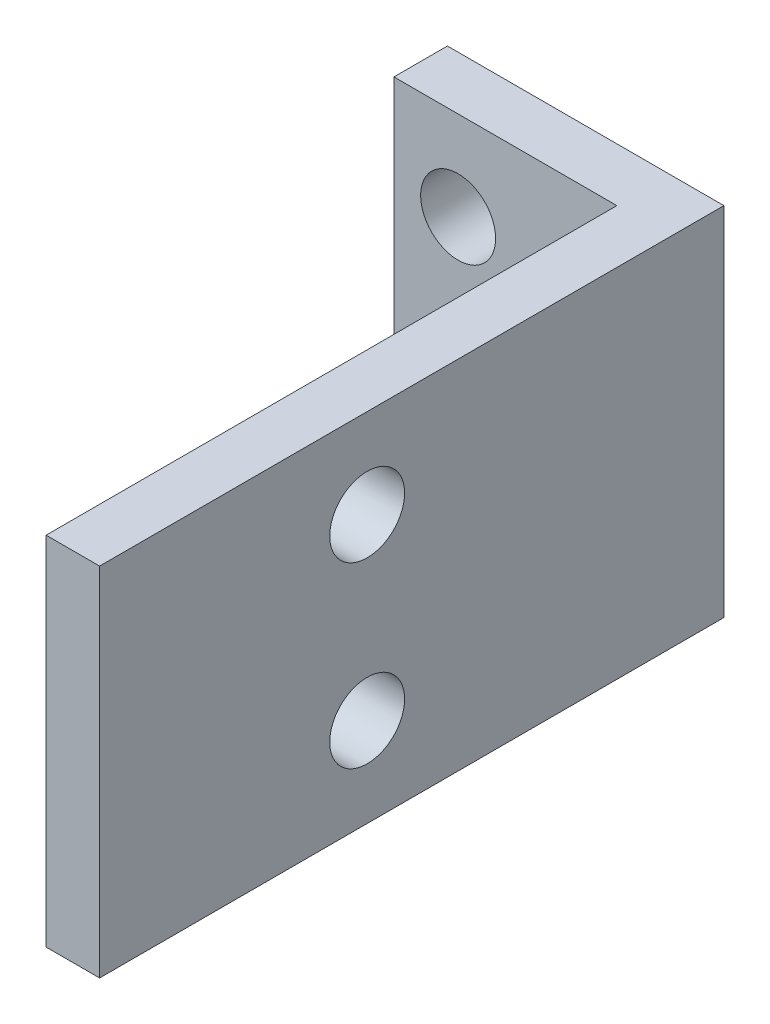
ISO-10303-21;
HEADER;
FILE_DESCRIPTION(('STEP AP214'),'2;1');
FILE_NAME('part.step','',(''),(''),'','','');
FILE_SCHEMA(('AUTOMOTIVE_DESIGN { 1 0 10303 214 1 1 1 1 }'));
ENDSEC;
DATA;
#1=APPLICATION_CONTEXT('core data for automotive mechanical design processes');
#2=APPLICATION_PROTOCOL_DEFINITION('international standard','automotive_design',2000,#1);
#3=PRODUCT_CONTEXT('',#1,'mechanical');
#4=PRODUCT('Part','Part','',(#3));
#5=PRODUCT_RELATED_PRODUCT_CATEGORY('part','',(#4));
#6=PRODUCT_DEFINITION_FORMATION('','',#4);
#7=PRODUCT_DEFINITION_CONTEXT('part definition',#1,'design');
#8=PRODUCT_DEFINITION('design','',#6,#7);
#9=PRODUCT_DEFINITION_SHAPE('','',#8);
#10=(LENGTH_UNIT() NAMED_UNIT(*) SI_UNIT(.MILLI.,.METRE.));
#11=(NAMED_UNIT(*) PLANE_ANGLE_UNIT() SI_UNIT($,.RADIAN.));
#12=(NAMED_UNIT(*) SI_UNIT($,.STERADIAN.) SOLID_ANGLE_UNIT());
#13=UNCERTAINTY_MEASURE_WITH_UNIT(LENGTH_MEASURE(1.E-05),#10,'distance_accuracy_value','');
#14=(GEOMETRIC_REPRESENTATION_CONTEXT(3) GLOBAL_UNCERTAINTY_ASSIGNED_CONTEXT((#13)) GLOBAL_UNIT_ASSIGNED_CONTEXT((#10,
#11,#12)) REPRESENTATION_CONTEXT('',''));
#15=CARTESIAN_POINT('',(0.,0.,0.));
#16=DIRECTION('',(0.,0.,1.));
#17=DIRECTION('',(1.,0.,0.));
#18=AXIS2_PLACEMENT_3D('',#15,#16,#17);
#19=CARTESIAN_POINT('',(36.,-30.,-9.99999999999995));
#20=DIRECTION('',(0.,0.,-1.));
#21=DIRECTION('',(-1.,0.,0.));
#22=AXIS2_PLACEMENT_3D('',#19,#20,#21);
#23=PLANE('',#22);
#24=CARTESIAN_POINT('',(24.1,-45.,-9.99999999999995));
#25=DIRECTION('',(0.,0.,1.));
#26=DIRECTION('',(1.,0.,0.));
#27=AXIS2_PLACEMENT_3D('',#24,#25,#26);
#28=CIRCLE('',#27,2.09999999999999);
#29=CARTESIAN_POINT('',(26.2,-45.,-9.99999999999995));
#30=VERTEX_POINT('',#29);
#31=EDGE_CURVE('E163',#30,#30,#28,.T.);
#32=ORIENTED_EDGE('',*,*,#31,.T.);
#33=EDGE_LOOP('',(#32));
#34=FACE_BOUND('',#33,.T.);
#35=CARTESIAN_POINT('',(24.1,-35.,-9.99999999999995));
#36=DIRECTION('',(0.,0.,1.));
#37=DIRECTION('',(1.,0.,0.));
#38=AXIS2_PLACEMENT_3D('',#35,#36,#37);
#39=CIRCLE('',#38,2.09999999999999);
#40=CARTESIAN_POINT('',(26.2,-35.,-9.99999999999995));
#41=VERTEX_POINT('',#40);
#42=EDGE_CURVE('E166',#41,#41,#39,.T.);
#43=ORIENTED_EDGE('',*,*,#42,.T.);
#44=EDGE_LOOP('',(#43));
#45=FACE_BOUND('',#44,.T.);
#46=DIRECTION('',(0.,-1.,0.));
#47=VECTOR('',#46,1.);
#48=CARTESIAN_POINT('',(20.5000000000001,-30.,-9.99999999999995));
#49=LINE('',#48,#47);
#50=CARTESIAN_POINT('',(20.5000000000001,-30.,-9.99999999999995));
#51=VERTEX_POINT('',#50);
#52=CARTESIAN_POINT('',(20.5000000000001,-50.,-9.99999999999995));
#53=VERTEX_POINT('',#52);
#54=EDGE_CURVE('E119',#51,#53,#49,.T.);
#55=ORIENTED_EDGE('',*,*,#54,.F.);
#56=DIRECTION('',(-1.,0.,0.));
#57=VECTOR('',#56,1.);
#58=CARTESIAN_POINT('',(36.,-30.,-9.99999999999995));
#59=LINE('',#58,#57);
#60=CARTESIAN_POINT('',(36.,-30.,-9.99999999999995));
#61=VERTEX_POINT('',#60);
#62=EDGE_CURVE('E11',#61,#51,#59,.T.);
#63=ORIENTED_EDGE('',*,*,#62,.F.);
#64=DIRECTION('',(0.,-1.,0.));
#65=VECTOR('',#64,1.);
#66=CARTESIAN_POINT('',(36.,-30.,-9.99999999999995));
#67=LINE('',#66,#65);
#68=CARTESIAN_POINT('',(36.,-50.,-9.99999999999995));
#69=VERTEX_POINT('',#68);
#70=EDGE_CURVE('E122',#61,#69,#67,.T.);
#71=ORIENTED_EDGE('',*,*,#70,.T.);
#72=DIRECTION('',(-1.,0.,0.));
#73=VECTOR('',#72,1.);
#74=CARTESIAN_POINT('',(36.,-50.,-9.99999999999995));
#75=LINE('',#74,#73);
#76=EDGE_CURVE('E77',#69,#53,#75,.T.);
#77=ORIENTED_EDGE('',*,*,#76,.T.);
#78=EDGE_LOOP('',(#55,#63,#71,#77));
#79=FACE_BOUND('',#78,.T.);
#80=ADVANCED_FACE('F32',(#34,#45,#79),#23,.T.);
#81=CARTESIAN_POINT('',(36.,-30.,25.0000000000001));
#82=DIRECTION('',(0.,1.,0.));
#83=DIRECTION('',(-1.,0.,0.));
#84=AXIS2_PLACEMENT_3D('',#81,#82,#83);
#85=PLANE('',#84);
#86=DIRECTION('',(0.,0.,1.));
#87=VECTOR('',#86,1.);
#88=CARTESIAN_POINT('',(33.,-30.,-6.99999999999995));
#89=LINE('',#88,#87);
#90=CARTESIAN_POINT('',(33.,-30.,-6.99999999999995));
#91=VERTEX_POINT('',#90);
#92=CARTESIAN_POINT('',(33.,-30.,25.0000000000001));
#93=VERTEX_POINT('',#92);
#94=EDGE_CURVE('E104',#91,#93,#89,.T.);
#95=ORIENTED_EDGE('',*,*,#94,.T.);
#96=DIRECTION('',(-1.,0.,0.));
#97=VECTOR('',#96,1.);
#98=CARTESIAN_POINT('',(36.,-30.,25.0000000000001));
#99=LINE('',#98,#97);
#100=CARTESIAN_POINT('',(36.,-30.,25.0000000000001));
#101=VERTEX_POINT('',#100);
#102=EDGE_CURVE('E40',#101,#93,#99,.T.);
#103=ORIENTED_EDGE('',*,*,#102,.F.);
#104=DIRECTION('',(0.,0.,-1.));
#105=VECTOR('',#104,1.);
#106=CARTESIAN_POINT('',(36.,-30.,25.0000000000001));
#107=LINE('',#106,#105);
#108=EDGE_CURVE('E129',#101,#61,#107,.T.);
#109=ORIENTED_EDGE('',*,*,#108,.T.);
#110=ORIENTED_EDGE('',*,*,#62,.T.);
#111=DIRECTION('',(0.,0.,-1.));
#112=VECTOR('',#111,1.);
#113=CARTESIAN_POINT('',(20.5000000000001,-30.,25.0000000000001));
#114=LINE('',#113,#112);
#115=CARTESIAN_POINT('',(20.5000000000001,-30.,-6.99999999999996));
#116=VERTEX_POINT('',#115);
#117=EDGE_CURVE('E71',#116,#51,#114,.T.);
#118=ORIENTED_EDGE('',*,*,#117,.F.);
#119=DIRECTION('',(1.,0.,0.));
#120=VECTOR('',#119,1.);
#121=CARTESIAN_POINT('',(20.5000000000001,-30.,-6.99999999999995));
#122=LINE('',#121,#120);
#123=EDGE_CURVE('E48',#116,#91,#122,.T.);
#124=ORIENTED_EDGE('',*,*,#123,.T.);
#125=EDGE_LOOP('',(#95,#103,#109,#110,#118,#124));
#126=FACE_BOUND('',#125,.T.);
#127=ADVANCED_FACE('F110',(#126),#85,.T.);
#128=CARTESIAN_POINT('',(36.,-50.,25.0000000000001));
#129=DIRECTION('',(0.,0.,1.));
#130=DIRECTION('',(1.,0.,0.));
#131=AXIS2_PLACEMENT_3D('',#128,#129,#130);
#132=PLANE('',#131);
#133=DIRECTION('',(0.,-1.,0.));
#134=VECTOR('',#133,1.);
#135=CARTESIAN_POINT('',(33.,-30.,25.0000000000001));
#136=LINE('',#135,#134);
#137=CARTESIAN_POINT('',(33.,-50.,25.0000000000001));
#138=VERTEX_POINT('',#137);
#139=EDGE_CURVE('E100',#93,#138,#136,.T.);
#140=ORIENTED_EDGE('',*,*,#139,.T.);
#141=DIRECTION('',(-1.,0.,0.));
#142=VECTOR('',#141,1.);
#143=CARTESIAN_POINT('',(36.,-50.,25.0000000000001));
#144=LINE('',#143,#142);
#145=CARTESIAN_POINT('',(36.,-50.,25.0000000000001));
#146=VERTEX_POINT('',#145);
#147=EDGE_CURVE('E138',#146,#138,#144,.T.);
#148=ORIENTED_EDGE('',*,*,#147,.F.);
#149=DIRECTION('',(0.,1.,0.));
#150=VECTOR('',#149,1.);
#151=CARTESIAN_POINT('',(36.,-50.,25.0000000000001));
#152=LINE('',#151,#150);
#153=EDGE_CURVE('E126',#146,#101,#152,.T.);
#154=ORIENTED_EDGE('',*,*,#153,.T.);
#155=ORIENTED_EDGE('',*,*,#102,.T.);
#156=EDGE_LOOP('',(#140,#148,#154,#155));
#157=FACE_BOUND('',#156,.T.);
#158=ADVANCED_FACE('F159',(#157),#132,.T.);
#159=CARTESIAN_POINT('',(36.,-50.,-9.99999999999995));
#160=DIRECTION('',(0.,-1.,0.));
#161=DIRECTION('',(1.,0.,0.));
#162=AXIS2_PLACEMENT_3D('',#159,#160,#161);
#163=PLANE('',#162);
#164=DIRECTION('',(0.,0.,1.));
#165=VECTOR('',#164,1.);
#166=CARTESIAN_POINT('',(33.,-50.,-6.99999999999995));
#167=LINE('',#166,#165);
#168=CARTESIAN_POINT('',(33.,-50.,-6.99999999999995));
#169=VERTEX_POINT('',#168);
#170=EDGE_CURVE('E111',#169,#138,#167,.T.);
#171=ORIENTED_EDGE('',*,*,#170,.F.);
#172=DIRECTION('',(1.,0.,0.));
#173=VECTOR('',#172,1.);
#174=CARTESIAN_POINT('',(20.5,-50.,-6.99999999999995));
#175=LINE('',#174,#173);
#176=CARTESIAN_POINT('',(20.5,-50.,-6.99999999999995));
#177=VERTEX_POINT('',#176);
#178=EDGE_CURVE('E97',#177,#169,#175,.T.);
#179=ORIENTED_EDGE('',*,*,#178,.F.);
#180=DIRECTION('',(0.,0.,1.));
#181=VECTOR('',#180,1.);
#182=CARTESIAN_POINT('',(20.5000000000001,-50.,-9.99999999999995));
#183=LINE('',#182,#181);
#184=EDGE_CURVE('E133',#53,#177,#183,.T.);
#185=ORIENTED_EDGE('',*,*,#184,.F.);
#186=ORIENTED_EDGE('',*,*,#76,.F.);
#187=DIRECTION('',(0.,0.,1.));
#188=VECTOR('',#187,1.);
#189=CARTESIAN_POINT('',(36.,-50.,-9.99999999999995));
#190=LINE('',#189,#188);
#191=EDGE_CURVE('E124',#69,#146,#190,.T.);
#192=ORIENTED_EDGE('',*,*,#191,.T.);
#193=ORIENTED_EDGE('',*,*,#147,.T.);
#194=EDGE_LOOP('',(#171,#179,#185,#186,#192,#193));
#195=FACE_BOUND('',#194,.T.);
#196=ADVANCED_FACE('F140',(#195),#163,.T.);
#197=CARTESIAN_POINT('',(36.0000000000001,0.,0.));
#198=DIRECTION('',(-1.,0.,0.));
#199=DIRECTION('',(0.,-1.,0.));
#200=AXIS2_PLACEMENT_3D('',#197,#198,#199);
#201=PLANE('',#200);
#202=CARTESIAN_POINT('',(36.,-35.,10.0000000000001));
#203=DIRECTION('',(1.,0.,0.));
#204=DIRECTION('',(0.,0.,-1.));
#205=AXIS2_PLACEMENT_3D('',#202,#203,#204);
#206=CIRCLE('',#205,2.09999999999998);
#207=CARTESIAN_POINT('',(36.,-35.,7.90000000000012));
#208=VERTEX_POINT('',#207);
#209=EDGE_CURVE('E168',#208,#208,#206,.T.);
#210=ORIENTED_EDGE('',*,*,#209,.F.);
#211=EDGE_LOOP('',(#210));
#212=FACE_BOUND('',#211,.T.);
#213=CARTESIAN_POINT('',(36.,-45.,10.));
#214=DIRECTION('',(1.,0.,0.));
#215=DIRECTION('',(0.,0.,-1.));
#216=AXIS2_PLACEMENT_3D('',#213,#214,#215);
#217=CIRCLE('',#216,2.09999999999998);
#218=CARTESIAN_POINT('',(36.,-45.,7.90000000000002));
#219=VERTEX_POINT('',#218);
#220=EDGE_CURVE('E176',#219,#219,#217,.T.);
#221=ORIENTED_EDGE('',*,*,#220,.F.);
#222=EDGE_LOOP('',(#221));
#223=FACE_BOUND('',#222,.T.);
#224=ORIENTED_EDGE('',*,*,#70,.F.);
#225=ORIENTED_EDGE('',*,*,#108,.F.);
#226=ORIENTED_EDGE('',*,*,#153,.F.);
#227=ORIENTED_EDGE('',*,*,#191,.F.);
#228=EDGE_LOOP('',(#224,#225,#226,#227));
#229=FACE_BOUND('',#228,.T.);
#230=ADVANCED_FACE('F143',(#212,#223,#229),#201,.F.);
#231=CARTESIAN_POINT('',(20.5000000000001,0.,0.));
#232=DIRECTION('',(-1.,0.,0.));
#233=DIRECTION('',(0.,-1.,0.));
#234=AXIS2_PLACEMENT_3D('',#231,#232,#233);
#235=PLANE('',#234);
#236=DIRECTION('',(0.,-1.,0.));
#237=VECTOR('',#236,1.);
#238=CARTESIAN_POINT('',(20.5000000000001,-30.,-6.99999999999995));
#239=LINE('',#238,#237);
#240=EDGE_CURVE('E101',#116,#177,#239,.T.);
#241=ORIENTED_EDGE('',*,*,#240,.F.);
#242=ORIENTED_EDGE('',*,*,#117,.T.);
#243=ORIENTED_EDGE('',*,*,#54,.T.);
#244=ORIENTED_EDGE('',*,*,#184,.T.);
#245=EDGE_LOOP('',(#241,#242,#243,#244));
#246=FACE_BOUND('',#245,.T.);
#247=ADVANCED_FACE('F141',(#246),#235,.T.);
#248=CARTESIAN_POINT('',(33.,-30.,-6.99999999999995));
#249=DIRECTION('',(1.,0.,0.));
#250=DIRECTION('',(0.,1.,0.));
#251=AXIS2_PLACEMENT_3D('',#248,#249,#250);
#252=PLANE('',#251);
#253=CARTESIAN_POINT('',(33.,-35.,10.0000000000001));
#254=DIRECTION('',(1.,0.,0.));
#255=DIRECTION('',(0.,1.,0.));
#256=AXIS2_PLACEMENT_3D('',#253,#254,#255);
#257=CIRCLE('',#256,2.09999999999998);
#258=CARTESIAN_POINT('',(33.,-32.9,10.0000000000001));
#259=VERTEX_POINT('',#258);
#260=EDGE_CURVE('E35',#259,#259,#257,.T.);
#261=ORIENTED_EDGE('',*,*,#260,.T.);
#262=EDGE_LOOP('',(#261));
#263=FACE_BOUND('',#262,.T.);
#264=CARTESIAN_POINT('',(33.,-45.,10.));
#265=DIRECTION('',(1.,0.,0.));
#266=DIRECTION('',(0.,1.,0.));
#267=AXIS2_PLACEMENT_3D('',#264,#265,#266);
#268=CIRCLE('',#267,2.09999999999998);
#269=CARTESIAN_POINT('',(33.,-42.9,10.));
#270=VERTEX_POINT('',#269);
#271=EDGE_CURVE('E115',#270,#270,#268,.T.);
#272=ORIENTED_EDGE('',*,*,#271,.T.);
#273=EDGE_LOOP('',(#272));
#274=FACE_BOUND('',#273,.T.);
#275=ORIENTED_EDGE('',*,*,#170,.T.);
#276=ORIENTED_EDGE('',*,*,#139,.F.);
#277=ORIENTED_EDGE('',*,*,#94,.F.);
#278=DIRECTION('',(0.,-1.,0.));
#279=VECTOR('',#278,1.);
#280=CARTESIAN_POINT('',(33.,-30.,-6.99999999999995));
#281=LINE('',#280,#279);
#282=EDGE_CURVE('E93',#91,#169,#281,.T.);
#283=ORIENTED_EDGE('',*,*,#282,.T.);
#284=EDGE_LOOP('',(#275,#276,#277,#283));
#285=FACE_BOUND('',#284,.T.);
#286=ADVANCED_FACE('F105',(#263,#274,#285),#252,.F.);
#287=CARTESIAN_POINT('',(20.5000000000001,-30.,-6.99999999999995));
#288=DIRECTION('',(0.,0.,-1.));
#289=DIRECTION('',(0.,1.,0.));
#290=AXIS2_PLACEMENT_3D('',#287,#288,#289);
#291=PLANE('',#290);
#292=CARTESIAN_POINT('',(24.1,-45.,-6.99999999999996));
#293=DIRECTION('',(0.,0.,1.));
#294=DIRECTION('',(1.,0.,0.));
#295=AXIS2_PLACEMENT_3D('',#292,#293,#294);
#296=CIRCLE('',#295,2.09999999999999);
#297=CARTESIAN_POINT('',(26.2,-45.,-6.99999999999996));
#298=VERTEX_POINT('',#297);
#299=EDGE_CURVE('E207',#298,#298,#296,.T.);
#300=ORIENTED_EDGE('',*,*,#299,.F.);
#301=EDGE_LOOP('',(#300));
#302=FACE_BOUND('',#301,.T.);
#303=CARTESIAN_POINT('',(24.1,-35.,-6.99999999999996));
#304=DIRECTION('',(0.,0.,1.));
#305=DIRECTION('',(1.,0.,0.));
#306=AXIS2_PLACEMENT_3D('',#303,#304,#305);
#307=CIRCLE('',#306,2.09999999999999);
#308=CARTESIAN_POINT('',(26.2,-35.,-6.99999999999996));
#309=VERTEX_POINT('',#308);
#310=EDGE_CURVE('E169',#309,#309,#307,.T.);
#311=ORIENTED_EDGE('',*,*,#310,.F.);
#312=EDGE_LOOP('',(#311));
#313=FACE_BOUND('',#312,.T.);
#314=ORIENTED_EDGE('',*,*,#178,.T.);
#315=ORIENTED_EDGE('',*,*,#282,.F.);
#316=ORIENTED_EDGE('',*,*,#123,.F.);
#317=ORIENTED_EDGE('',*,*,#240,.T.);
#318=EDGE_LOOP('',(#314,#315,#316,#317));
#319=FACE_BOUND('',#318,.T.);
#320=ADVANCED_FACE('F95',(#302,#313,#319),#291,.F.);
#321=CARTESIAN_POINT('',(36.,-45.,10.));
#322=DIRECTION('',(1.,0.,0.));
#323=DIRECTION('',(0.,0.,-1.));
#324=AXIS2_PLACEMENT_3D('',#321,#322,#323);
#325=CYLINDRICAL_SURFACE('',#324,2.09999999999998);
#326=ORIENTED_EDGE('',*,*,#220,.T.);
#327=EDGE_LOOP('',(#326));
#328=FACE_BOUND('',#327,.T.);
#329=ORIENTED_EDGE('',*,*,#271,.F.);
#330=EDGE_LOOP('',(#329));
#331=FACE_BOUND('',#330,.T.);
#332=ADVANCED_FACE('F188',(#328,#331),#325,.F.);
#333=CARTESIAN_POINT('',(36.,-35.,10.0000000000001));
#334=DIRECTION('',(1.,0.,0.));
#335=DIRECTION('',(0.,0.,-1.));
#336=AXIS2_PLACEMENT_3D('',#333,#334,#335);
#337=CYLINDRICAL_SURFACE('',#336,2.09999999999998);
#338=ORIENTED_EDGE('',*,*,#209,.T.);
#339=EDGE_LOOP('',(#338));
#340=FACE_BOUND('',#339,.T.);
#341=ORIENTED_EDGE('',*,*,#260,.F.);
#342=EDGE_LOOP('',(#341));
#343=FACE_BOUND('',#342,.T.);
#344=ADVANCED_FACE('F185',(#340,#343),#337,.F.);
#345=CARTESIAN_POINT('',(24.1,-35.,-6.99999999999996));
#346=DIRECTION('',(0.,0.,1.));
#347=DIRECTION('',(1.,0.,0.));
#348=AXIS2_PLACEMENT_3D('',#345,#346,#347);
#349=CYLINDRICAL_SURFACE('',#348,2.09999999999999);
#350=ORIENTED_EDGE('',*,*,#42,.F.);
#351=EDGE_LOOP('',(#350));
#352=FACE_BOUND('',#351,.T.);
#353=ORIENTED_EDGE('',*,*,#310,.T.);
#354=EDGE_LOOP('',(#353));
#355=FACE_BOUND('',#354,.T.);
#356=ADVANCED_FACE('F187',(#352,#355),#349,.F.);
#357=CARTESIAN_POINT('',(24.1,-45.,-6.99999999999996));
#358=DIRECTION('',(0.,0.,1.));
#359=DIRECTION('',(1.,0.,0.));
#360=AXIS2_PLACEMENT_3D('',#357,#358,#359);
#361=CYLINDRICAL_SURFACE('',#360,2.09999999999999);
#362=ORIENTED_EDGE('',*,*,#31,.F.);
#363=EDGE_LOOP('',(#362));
#364=FACE_BOUND('',#363,.T.);
#365=ORIENTED_EDGE('',*,*,#299,.T.);
#366=EDGE_LOOP('',(#365));
#367=FACE_BOUND('',#366,.T.);
#368=ADVANCED_FACE('F195',(#364,#367),#361,.F.);
#369=CLOSED_SHELL('',(#80,#127,#158,#196,#230,#247,#286,#320,#332,#344,#356,#368));
#370=MANIFOLD_SOLID_BREP('B2',#369);
#371=ADVANCED_BREP_SHAPE_REPRESENTATION('',(#18,#370),#14);
#372=SHAPE_DEFINITION_REPRESENTATION(#9,#371);
ENDSEC;
END-ISO-10303-21;
